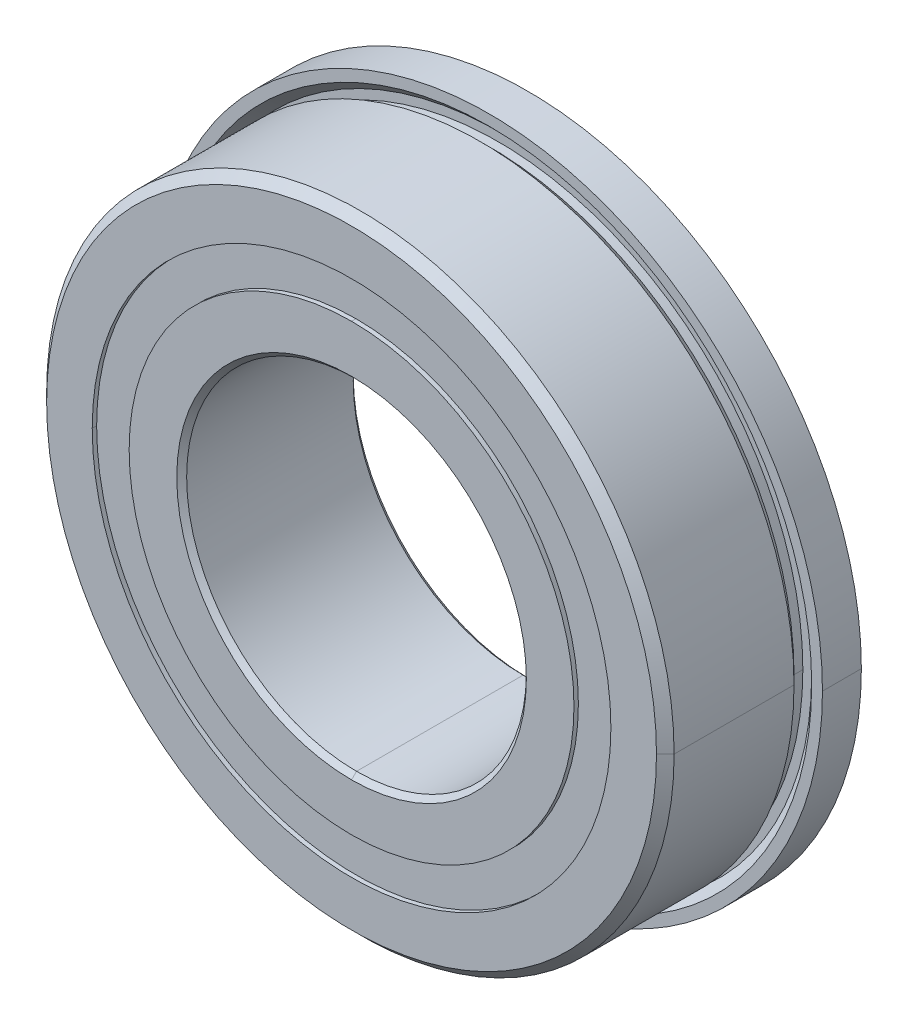
ISO-10303-21;
HEADER;
FILE_DESCRIPTION(('STEP AP214'),'2;1');
FILE_NAME('part.step','',(''),(''),'','','');
FILE_SCHEMA(('AUTOMOTIVE_DESIGN { 1 0 10303 214 1 1 1 1 }'));
ENDSEC;
DATA;
#1=APPLICATION_CONTEXT('core data for automotive mechanical design processes');
#2=APPLICATION_PROTOCOL_DEFINITION('international standard','automotive_design',2000,#1);
#3=PRODUCT_CONTEXT('',#1,'mechanical');
#4=PRODUCT('Part','Part','',(#3));
#5=PRODUCT_RELATED_PRODUCT_CATEGORY('part','',(#4));
#6=PRODUCT_DEFINITION_FORMATION('','',#4);
#7=PRODUCT_DEFINITION_CONTEXT('part definition',#1,'design');
#8=PRODUCT_DEFINITION('design','',#6,#7);
#9=PRODUCT_DEFINITION_SHAPE('','',#8);
#10=(LENGTH_UNIT() NAMED_UNIT(*) SI_UNIT(.MILLI.,.METRE.));
#11=(NAMED_UNIT(*) PLANE_ANGLE_UNIT() SI_UNIT($,.RADIAN.));
#12=(NAMED_UNIT(*) SI_UNIT($,.STERADIAN.) SOLID_ANGLE_UNIT());
#13=UNCERTAINTY_MEASURE_WITH_UNIT(LENGTH_MEASURE(1.E-05),#10,'distance_accuracy_value','');
#14=(GEOMETRIC_REPRESENTATION_CONTEXT(3) GLOBAL_UNCERTAINTY_ASSIGNED_CONTEXT((#13)) GLOBAL_UNIT_ASSIGNED_CONTEXT((#10,
#11,#12)) REPRESENTATION_CONTEXT('',''));
#15=CARTESIAN_POINT('',(0.,0.,0.));
#16=DIRECTION('',(0.,0.,1.));
#17=DIRECTION('',(1.,0.,0.));
#18=AXIS2_PLACEMENT_3D('',#15,#16,#17);
#19=CARTESIAN_POINT('',(0.,0.,3.392678));
#20=DIRECTION('',(0.,0.,-1.));
#21=DIRECTION('',(0.,-1.,0.));
#22=AXIS2_PLACEMENT_3D('',#19,#20,#21);
#23=PLANE('',#22);
#24=CARTESIAN_POINT('',(0.,0.,3.392678));
#25=DIRECTION('',(0.,0.,-1.));
#26=DIRECTION('',(-1.,0.,0.));
#27=AXIS2_PLACEMENT_3D('',#24,#25,#26);
#28=CIRCLE('',#27,9.00274725274725);
#29=CARTESIAN_POINT('',(0.,-9.00274725274725,3.392678));
#30=VERTEX_POINT('',#29);
#31=CARTESIAN_POINT('',(0.,9.00274725274725,3.392678));
#32=VERTEX_POINT('',#31);
#33=EDGE_CURVE('E171',#30,#32,#28,.T.);
#34=ORIENTED_EDGE('',*,*,#33,.T.);
#35=CARTESIAN_POINT('',(0.,0.,3.392678));
#36=DIRECTION('',(0.,0.,-1.));
#37=DIRECTION('',(-1.,0.,0.));
#38=AXIS2_PLACEMENT_3D('',#35,#36,#37);
#39=CIRCLE('',#38,9.00274725274725);
#40=EDGE_CURVE('E185',#32,#30,#39,.T.);
#41=ORIENTED_EDGE('',*,*,#40,.T.);
#42=EDGE_LOOP('',(#34,#41));
#43=FACE_BOUND('',#42,.T.);
#44=CARTESIAN_POINT('',(0.,0.,3.392678));
#45=DIRECTION('',(0.,0.,-1.));
#46=DIRECTION('',(-1.,0.,0.));
#47=AXIS2_PLACEMENT_3D('',#44,#45,#46);
#48=CIRCLE('',#47,10.4972527472527);
#49=CARTESIAN_POINT('',(-10.4972527472527,0.,3.392678));
#50=VERTEX_POINT('',#49);
#51=CARTESIAN_POINT('',(10.4972527472527,0.,3.392678));
#52=VERTEX_POINT('',#51);
#53=EDGE_CURVE('E10',#50,#52,#48,.T.);
#54=ORIENTED_EDGE('',*,*,#53,.F.);
#55=CARTESIAN_POINT('',(0.,0.,3.392678));
#56=DIRECTION('',(0.,0.,-1.));
#57=DIRECTION('',(-1.,0.,0.));
#58=AXIS2_PLACEMENT_3D('',#55,#56,#57);
#59=CIRCLE('',#58,10.4972527472527);
#60=EDGE_CURVE('E319',#52,#50,#59,.T.);
#61=ORIENTED_EDGE('',*,*,#60,.F.);
#62=EDGE_LOOP('',(#54,#61));
#63=FACE_BOUND('',#62,.T.);
#64=ADVANCED_FACE('F15',(#43,#63),#23,.F.);
#65=CARTESIAN_POINT('',(0.,0.,0.));
#66=DIRECTION('',(0.,0.,-1.));
#67=DIRECTION('',(-1.,0.,0.));
#68=AXIS2_PLACEMENT_3D('',#65,#66,#67);
#69=CYLINDRICAL_SURFACE('',#68,10.4972527472527);
#70=DIRECTION('',(0.,0.,-1.));
#71=VECTOR('',#70,1.);
#72=CARTESIAN_POINT('',(10.4972527472527,0.,0.));
#73=LINE('',#72,#71);
#74=CARTESIAN_POINT('',(10.4972527472527,0.,3.57124));
#75=VERTEX_POINT('',#74);
#76=EDGE_CURVE('E257',#75,#52,#73,.T.);
#77=ORIENTED_EDGE('',*,*,#76,.F.);
#78=CARTESIAN_POINT('',(0.,0.,3.57124));
#79=DIRECTION('',(0.,0.,-1.));
#80=DIRECTION('',(-1.,0.,0.));
#81=AXIS2_PLACEMENT_3D('',#78,#79,#80);
#82=CIRCLE('',#81,10.4972527472527);
#83=CARTESIAN_POINT('',(-10.4972527472527,0.,3.57124));
#84=VERTEX_POINT('',#83);
#85=EDGE_CURVE('E26',#84,#75,#82,.T.);
#86=ORIENTED_EDGE('',*,*,#85,.F.);
#87=DIRECTION('',(0.,0.,-1.));
#88=VECTOR('',#87,1.);
#89=CARTESIAN_POINT('',(-10.4972527472527,0.,0.));
#90=LINE('',#89,#88);
#91=EDGE_CURVE('E356',#84,#50,#90,.T.);
#92=ORIENTED_EDGE('',*,*,#91,.T.);
#93=ORIENTED_EDGE('',*,*,#53,.T.);
#94=EDGE_LOOP('',(#77,#86,#92,#93));
#95=FACE_BOUND('',#94,.T.);
#96=ADVANCED_FACE('F472',(#95),#69,.F.);
#97=CARTESIAN_POINT('',(0.,0.,3.57124));
#98=DIRECTION('',(0.,0.,-1.));
#99=DIRECTION('',(0.,-1.,0.));
#100=AXIS2_PLACEMENT_3D('',#97,#98,#99);
#101=PLANE('',#100);
#102=ORIENTED_EDGE('',*,*,#85,.T.);
#103=CARTESIAN_POINT('',(0.,0.,3.57124));
#104=DIRECTION('',(0.,0.,-1.));
#105=DIRECTION('',(-1.,0.,0.));
#106=AXIS2_PLACEMENT_3D('',#103,#104,#105);
#107=CIRCLE('',#106,10.4972527472527);
#108=EDGE_CURVE('E253',#75,#84,#107,.T.);
#109=ORIENTED_EDGE('',*,*,#108,.T.);
#110=EDGE_LOOP('',(#102,#109));
#111=FACE_BOUND('',#110,.T.);
#112=CARTESIAN_POINT('',(0.,0.,3.57124));
#113=DIRECTION('',(0.,0.,-1.));
#114=DIRECTION('',(-1.,0.,0.));
#115=AXIS2_PLACEMENT_3D('',#112,#113,#114);
#116=CIRCLE('',#115,12.3428760000003);
#117=CARTESIAN_POINT('',(-12.3428760000003,0.,3.57124));
#118=VERTEX_POINT('',#117);
#119=CARTESIAN_POINT('',(12.3428760000003,0.,3.57124));
#120=VERTEX_POINT('',#119);
#121=EDGE_CURVE('E360',#118,#120,#116,.T.);
#122=ORIENTED_EDGE('',*,*,#121,.F.);
#123=CARTESIAN_POINT('',(0.,0.,3.57124));
#124=DIRECTION('',(0.,0.,-1.));
#125=DIRECTION('',(-1.,0.,0.));
#126=AXIS2_PLACEMENT_3D('',#123,#124,#125);
#127=CIRCLE('',#126,12.3428760000003);
#128=EDGE_CURVE('E303',#120,#118,#127,.T.);
#129=ORIENTED_EDGE('',*,*,#128,.F.);
#130=EDGE_LOOP('',(#122,#129));
#131=FACE_BOUND('',#130,.T.);
#132=ADVANCED_FACE('F477',(#111,#131),#101,.F.);
#133=CARTESIAN_POINT('',(0.,0.,3.57124));
#134=DIRECTION('',(0.,0.,-1.));
#135=DIRECTION('',(-1.,0.,0.));
#136=AXIS2_PLACEMENT_3D('',#133,#134,#135);
#137=CONICAL_SURFACE('',#136,12.3428760000003,0.785398163397077);
#138=DIRECTION('',(0.707106781186285,0.,-0.70710678118681));
#139=VECTOR('',#138,1.);
#140=CARTESIAN_POINT('',(12.3428760000003,0.,3.57124));
#141=LINE('',#140,#139);
#142=CARTESIAN_POINT('',(12.7,0.,3.214116));
#143=VERTEX_POINT('',#142);
#144=EDGE_CURVE('E355',#120,#143,#141,.T.);
#145=ORIENTED_EDGE('',*,*,#144,.F.);
#146=ORIENTED_EDGE('',*,*,#128,.T.);
#147=DIRECTION('',(-0.707106781186285,0.,-0.70710678118681));
#148=VECTOR('',#147,1.);
#149=CARTESIAN_POINT('',(-12.3428760000003,0.,3.57124));
#150=LINE('',#149,#148);
#151=CARTESIAN_POINT('',(-12.7,0.,3.214116));
#152=VERTEX_POINT('',#151);
#153=EDGE_CURVE('E228',#118,#152,#150,.T.);
#154=ORIENTED_EDGE('',*,*,#153,.T.);
#155=CARTESIAN_POINT('',(0.,0.,3.214116));
#156=DIRECTION('',(0.,0.,-1.));
#157=DIRECTION('',(-1.,0.,0.));
#158=AXIS2_PLACEMENT_3D('',#155,#156,#157);
#159=CIRCLE('',#158,12.7);
#160=EDGE_CURVE('E291',#143,#152,#159,.T.);
#161=ORIENTED_EDGE('',*,*,#160,.F.);
#162=EDGE_LOOP('',(#145,#146,#154,#161));
#163=FACE_BOUND('',#162,.T.);
#164=ADVANCED_FACE('F511',(#163),#137,.T.);
#165=CARTESIAN_POINT('',(0.,0.,0.));
#166=DIRECTION('',(0.,0.,-1.));
#167=DIRECTION('',(-1.,0.,0.));
#168=AXIS2_PLACEMENT_3D('',#165,#166,#167);
#169=CYLINDRICAL_SURFACE('',#168,12.7);
#170=DIRECTION('',(0.,0.,-1.));
#171=VECTOR('',#170,1.);
#172=CARTESIAN_POINT('',(12.7,0.,0.));
#173=LINE('',#172,#171);
#174=CARTESIAN_POINT('',(12.7,0.,-1.63931600000027));
#175=VERTEX_POINT('',#174);
#176=EDGE_CURVE('E223',#143,#175,#173,.T.);
#177=ORIENTED_EDGE('',*,*,#176,.F.);
#178=ORIENTED_EDGE('',*,*,#160,.T.);
#179=DIRECTION('',(0.,0.,-1.));
#180=VECTOR('',#179,1.);
#181=CARTESIAN_POINT('',(-12.7,0.,0.));
#182=LINE('',#181,#180);
#183=CARTESIAN_POINT('',(-12.7,0.,-1.63931600000027));
#184=VERTEX_POINT('',#183);
#185=EDGE_CURVE('E240',#152,#184,#182,.T.);
#186=ORIENTED_EDGE('',*,*,#185,.T.);
#187=CARTESIAN_POINT('',(0.,0.,-1.63931600000027));
#188=DIRECTION('',(0.,0.,-1.));
#189=DIRECTION('',(-1.,0.,0.));
#190=AXIS2_PLACEMENT_3D('',#187,#188,#189);
#191=CIRCLE('',#190,12.7);
#192=EDGE_CURVE('E287',#175,#184,#191,.T.);
#193=ORIENTED_EDGE('',*,*,#192,.F.);
#194=EDGE_LOOP('',(#177,#178,#186,#193));
#195=FACE_BOUND('',#194,.T.);
#196=ADVANCED_FACE('F513',(#195),#169,.T.);
#197=CARTESIAN_POINT('',(0.,0.,-1.63931600000027));
#198=DIRECTION('',(0.,0.,1.));
#199=DIRECTION('',(1.,0.,0.));
#200=AXIS2_PLACEMENT_3D('',#197,#198,#199);
#201=CONICAL_SURFACE('',#200,12.7,0.785398163397787);
#202=DIRECTION('',(-0.707106781186788,0.,0.707106781186307));
#203=VECTOR('',#202,1.);
#204=CARTESIAN_POINT('',(-12.7,0.,-1.63931600000027));
#205=LINE('',#204,#203);
#206=CARTESIAN_POINT('',(-12.342876,0.,-1.99644));
#207=VERTEX_POINT('',#206);
#208=EDGE_CURVE('E207',#207,#184,#205,.T.);
#209=ORIENTED_EDGE('',*,*,#208,.F.);
#210=CARTESIAN_POINT('',(0.,0.,-1.99644));
#211=DIRECTION('',(0.,0.,-1.));
#212=DIRECTION('',(-1.,0.,0.));
#213=AXIS2_PLACEMENT_3D('',#210,#211,#212);
#214=CIRCLE('',#213,12.342876);
#215=CARTESIAN_POINT('',(12.342876,0.,-1.99644));
#216=VERTEX_POINT('',#215);
#217=EDGE_CURVE('E286',#216,#207,#214,.T.);
#218=ORIENTED_EDGE('',*,*,#217,.F.);
#219=DIRECTION('',(0.707106781186788,0.,0.707106781186307));
#220=VECTOR('',#219,1.);
#221=CARTESIAN_POINT('',(12.7,0.,-1.63931600000027));
#222=LINE('',#221,#220);
#223=EDGE_CURVE('E204',#216,#175,#222,.T.);
#224=ORIENTED_EDGE('',*,*,#223,.T.);
#225=ORIENTED_EDGE('',*,*,#192,.T.);
#226=EDGE_LOOP('',(#209,#218,#224,#225));
#227=FACE_BOUND('',#226,.T.);
#228=ADVANCED_FACE('F536',(#227),#201,.T.);
#229=CARTESIAN_POINT('',(0.,0.,0.));
#230=DIRECTION('',(0.,0.,-1.));
#231=DIRECTION('',(-1.,0.,0.));
#232=AXIS2_PLACEMENT_3D('',#229,#230,#231);
#233=CYLINDRICAL_SURFACE('',#232,12.342876);
#234=DIRECTION('',(0.,0.,-1.));
#235=VECTOR('',#234,1.);
#236=CARTESIAN_POINT('',(12.342876,0.,0.));
#237=LINE('',#236,#235);
#238=CARTESIAN_POINT('',(12.342876,0.,-2.35356399999971));
#239=VERTEX_POINT('',#238);
#240=EDGE_CURVE('E19',#216,#239,#237,.T.);
#241=ORIENTED_EDGE('',*,*,#240,.F.);
#242=ORIENTED_EDGE('',*,*,#217,.T.);
#243=DIRECTION('',(0.,0.,-1.));
#244=VECTOR('',#243,1.);
#245=CARTESIAN_POINT('',(-12.342876,0.,0.));
#246=LINE('',#245,#244);
#247=CARTESIAN_POINT('',(-12.342876,0.,-2.35356399999971));
#248=VERTEX_POINT('',#247);
#249=EDGE_CURVE('E233',#207,#248,#246,.T.);
#250=ORIENTED_EDGE('',*,*,#249,.T.);
#251=CARTESIAN_POINT('',(0.,0.,-2.35356399999971));
#252=DIRECTION('',(0.,0.,-1.));
#253=DIRECTION('',(-1.,0.,0.));
#254=AXIS2_PLACEMENT_3D('',#251,#252,#253);
#255=CIRCLE('',#254,12.342876);
#256=EDGE_CURVE('E283',#239,#248,#255,.T.);
#257=ORIENTED_EDGE('',*,*,#256,.F.);
#258=EDGE_LOOP('',(#241,#242,#250,#257));
#259=FACE_BOUND('',#258,.T.);
#260=ADVANCED_FACE('F539',(#259),#233,.T.);
#261=CARTESIAN_POINT('',(0.,0.,-2.35356399999971));
#262=DIRECTION('',(0.,0.,-1.));
#263=DIRECTION('',(0.,-1.,0.));
#264=AXIS2_PLACEMENT_3D('',#261,#262,#263);
#265=PLANE('',#264);
#266=CARTESIAN_POINT('',(0.,0.,-2.35356399999971));
#267=DIRECTION('',(0.,0.,-1.));
#268=DIRECTION('',(-1.,0.,0.));
#269=AXIS2_PLACEMENT_3D('',#266,#267,#268);
#270=CIRCLE('',#269,12.342876);
#271=EDGE_CURVE('E229',#248,#239,#270,.T.);
#272=ORIENTED_EDGE('',*,*,#271,.T.);
#273=ORIENTED_EDGE('',*,*,#256,.T.);
#274=EDGE_LOOP('',(#272,#273));
#275=FACE_BOUND('',#274,.T.);
#276=CARTESIAN_POINT('',(0.,0.,-2.35356399999971));
#277=DIRECTION('',(0.,0.,-1.));
#278=DIRECTION('',(-1.,0.,0.));
#279=AXIS2_PLACEMENT_3D('',#276,#277,#278);
#280=CIRCLE('',#279,12.6999999999998);
#281=CARTESIAN_POINT('',(12.6999999999998,0.,-2.35356399999971));
#282=VERTEX_POINT('',#281);
#283=CARTESIAN_POINT('',(-12.6999999999998,0.,-2.35356399999971));
#284=VERTEX_POINT('',#283);
#285=EDGE_CURVE('E249',#282,#284,#280,.T.);
#286=ORIENTED_EDGE('',*,*,#285,.F.);
#287=CARTESIAN_POINT('',(0.,0.,-2.35356399999971));
#288=DIRECTION('',(0.,0.,-1.));
#289=DIRECTION('',(-1.,0.,0.));
#290=AXIS2_PLACEMENT_3D('',#287,#288,#289);
#291=CIRCLE('',#290,12.6999999999998);
#292=EDGE_CURVE('E268',#284,#282,#291,.T.);
#293=ORIENTED_EDGE('',*,*,#292,.F.);
#294=EDGE_LOOP('',(#286,#293));
#295=FACE_BOUND('',#294,.T.);
#296=ADVANCED_FACE('F494',(#275,#295),#265,.F.);
#297=CARTESIAN_POINT('',(0.,0.,-2.35356399999971));
#298=DIRECTION('',(0.,0.,1.));
#299=DIRECTION('',(1.,0.,0.));
#300=AXIS2_PLACEMENT_3D('',#297,#298,#299);
#301=CONICAL_SURFACE('',#300,12.6999999999998,0.785398163397835);
#302=DIRECTION('',(-0.707106781186821,0.,0.707106781186274));
#303=VECTOR('',#302,1.);
#304=CARTESIAN_POINT('',(-12.6999999999998,0.,-2.35356399999971));
#305=LINE('',#304,#303);
#306=CARTESIAN_POINT('',(-13.0571239999997,0.,-1.99644));
#307=VERTEX_POINT('',#306);
#308=EDGE_CURVE('E244',#284,#307,#305,.T.);
#309=ORIENTED_EDGE('',*,*,#308,.F.);
#310=ORIENTED_EDGE('',*,*,#292,.T.);
#311=DIRECTION('',(0.707106781186821,0.,0.707106781186274));
#312=VECTOR('',#311,1.);
#313=CARTESIAN_POINT('',(12.6999999999998,0.,-2.35356399999971));
#314=LINE('',#313,#312);
#315=CARTESIAN_POINT('',(13.0571239999997,0.,-1.99644));
#316=VERTEX_POINT('',#315);
#317=EDGE_CURVE('E327',#282,#316,#314,.T.);
#318=ORIENTED_EDGE('',*,*,#317,.T.);
#319=CARTESIAN_POINT('',(0.,0.,-1.99644));
#320=DIRECTION('',(0.,0.,-1.));
#321=DIRECTION('',(-1.,0.,0.));
#322=AXIS2_PLACEMENT_3D('',#319,#320,#321);
#323=CIRCLE('',#322,13.0571239999997);
#324=EDGE_CURVE('E264',#307,#316,#323,.T.);
#325=ORIENTED_EDGE('',*,*,#324,.F.);
#326=EDGE_LOOP('',(#309,#310,#318,#325));
#327=FACE_BOUND('',#326,.T.);
#328=ADVANCED_FACE('F492',(#327),#301,.F.);
#329=CARTESIAN_POINT('',(0.,0.,-1.99644));
#330=DIRECTION('',(0.,0.,-1.));
#331=DIRECTION('',(0.,-1.,0.));
#332=AXIS2_PLACEMENT_3D('',#329,#330,#331);
#333=PLANE('',#332);
#334=CARTESIAN_POINT('',(0.,0.,-1.99644));
#335=DIRECTION('',(0.,0.,-1.));
#336=DIRECTION('',(-1.,0.,0.));
#337=AXIS2_PLACEMENT_3D('',#334,#335,#336);
#338=CIRCLE('',#337,13.0571239999997);
#339=EDGE_CURVE('E248',#316,#307,#338,.T.);
#340=ORIENTED_EDGE('',*,*,#339,.T.);
#341=ORIENTED_EDGE('',*,*,#324,.T.);
#342=EDGE_LOOP('',(#340,#341));
#343=FACE_BOUND('',#342,.T.);
#344=CARTESIAN_POINT('',(0.,0.,-1.99644));
#345=DIRECTION('',(0.,0.,-1.));
#346=DIRECTION('',(-1.,0.,0.));
#347=AXIS2_PLACEMENT_3D('',#344,#345,#346);
#348=CIRCLE('',#347,13.49375);
#349=CARTESIAN_POINT('',(-13.49375,0.,-1.99644));
#350=VERTEX_POINT('',#349);
#351=CARTESIAN_POINT('',(13.49375,0.,-1.99644));
#352=VERTEX_POINT('',#351);
#353=EDGE_CURVE('E277',#350,#352,#348,.T.);
#354=ORIENTED_EDGE('',*,*,#353,.F.);
#355=CARTESIAN_POINT('',(0.,0.,-1.99644));
#356=DIRECTION('',(0.,0.,-1.));
#357=DIRECTION('',(-1.,0.,0.));
#358=AXIS2_PLACEMENT_3D('',#355,#356,#357);
#359=CIRCLE('',#358,13.49375);
#360=EDGE_CURVE('E217',#352,#350,#359,.T.);
#361=ORIENTED_EDGE('',*,*,#360,.F.);
#362=EDGE_LOOP('',(#354,#361));
#363=FACE_BOUND('',#362,.T.);
#364=ADVANCED_FACE('F487',(#343,#363),#333,.F.);
#365=CARTESIAN_POINT('',(0.,0.,0.));
#366=DIRECTION('',(0.,0.,-1.));
#367=DIRECTION('',(-1.,0.,0.));
#368=AXIS2_PLACEMENT_3D('',#365,#366,#367);
#369=CYLINDRICAL_SURFACE('',#368,13.49375);
#370=DIRECTION('',(0.,0.,-1.));
#371=VECTOR('',#370,1.);
#372=CARTESIAN_POINT('',(13.49375,0.,0.));
#373=LINE('',#372,#371);
#374=CARTESIAN_POINT('',(13.49375,0.,-3.57124));
#375=VERTEX_POINT('',#374);
#376=EDGE_CURVE('E272',#352,#375,#373,.T.);
#377=ORIENTED_EDGE('',*,*,#376,.F.);
#378=ORIENTED_EDGE('',*,*,#360,.T.);
#379=DIRECTION('',(0.,0.,-1.));
#380=VECTOR('',#379,1.);
#381=CARTESIAN_POINT('',(-13.49375,0.,0.));
#382=LINE('',#381,#380);
#383=CARTESIAN_POINT('',(-13.49375,0.,-3.57124));
#384=VERTEX_POINT('',#383);
#385=EDGE_CURVE('E323',#350,#384,#382,.T.);
#386=ORIENTED_EDGE('',*,*,#385,.T.);
#387=CARTESIAN_POINT('',(0.,0.,-3.57124));
#388=DIRECTION('',(0.,0.,-1.));
#389=DIRECTION('',(-1.,0.,0.));
#390=AXIS2_PLACEMENT_3D('',#387,#388,#389);
#391=CIRCLE('',#390,13.49375);
#392=EDGE_CURVE('E213',#375,#384,#391,.T.);
#393=ORIENTED_EDGE('',*,*,#392,.F.);
#394=EDGE_LOOP('',(#377,#378,#386,#393));
#395=FACE_BOUND('',#394,.T.);
#396=ADVANCED_FACE('F483',(#395),#369,.T.);
#397=CARTESIAN_POINT('',(0.,0.,-3.57124));
#398=DIRECTION('',(0.,0.,1.));
#399=DIRECTION('',(1.,0.,0.));
#400=AXIS2_PLACEMENT_3D('',#397,#398,#399);
#401=PLANE('',#400);
#402=CARTESIAN_POINT('',(0.,0.,-3.57124));
#403=DIRECTION('',(0.,0.,-1.));
#404=DIRECTION('',(-1.,0.,0.));
#405=AXIS2_PLACEMENT_3D('',#402,#403,#404);
#406=CIRCLE('',#405,10.4972527472527);
#407=CARTESIAN_POINT('',(-10.4972527472527,0.,-3.57124));
#408=VERTEX_POINT('',#407);
#409=CARTESIAN_POINT('',(10.4972527472527,0.,-3.57124));
#410=VERTEX_POINT('',#409);
#411=EDGE_CURVE('E218',#408,#410,#406,.T.);
#412=ORIENTED_EDGE('',*,*,#411,.F.);
#413=CARTESIAN_POINT('',(0.,0.,-3.57124));
#414=DIRECTION('',(0.,0.,-1.));
#415=DIRECTION('',(-1.,0.,0.));
#416=AXIS2_PLACEMENT_3D('',#413,#414,#415);
#417=CIRCLE('',#416,10.4972527472527);
#418=EDGE_CURVE('E262',#410,#408,#417,.T.);
#419=ORIENTED_EDGE('',*,*,#418,.F.);
#420=EDGE_LOOP('',(#412,#419));
#421=FACE_BOUND('',#420,.T.);
#422=CARTESIAN_POINT('',(0.,0.,-3.57124));
#423=DIRECTION('',(0.,0.,-1.));
#424=DIRECTION('',(-1.,0.,0.));
#425=AXIS2_PLACEMENT_3D('',#422,#423,#424);
#426=CIRCLE('',#425,13.49375);
#427=EDGE_CURVE('E276',#384,#375,#426,.T.);
#428=ORIENTED_EDGE('',*,*,#427,.T.);
#429=ORIENTED_EDGE('',*,*,#392,.T.);
#430=EDGE_LOOP('',(#428,#429));
#431=FACE_BOUND('',#430,.T.);
#432=ADVANCED_FACE('F486',(#421,#431),#401,.F.);
#433=CARTESIAN_POINT('',(0.,0.,0.));
#434=DIRECTION('',(0.,0.,-1.));
#435=DIRECTION('',(-1.,0.,0.));
#436=AXIS2_PLACEMENT_3D('',#433,#434,#435);
#437=CYLINDRICAL_SURFACE('',#436,10.4972527472527);
#438=DIRECTION('',(0.,0.,-1.));
#439=VECTOR('',#438,1.);
#440=CARTESIAN_POINT('',(10.4972527472527,0.,0.));
#441=LINE('',#440,#439);
#442=CARTESIAN_POINT('',(10.4972527472527,0.,-3.392678));
#443=VERTEX_POINT('',#442);
#444=EDGE_CURVE('E258',#443,#410,#441,.T.);
#445=ORIENTED_EDGE('',*,*,#444,.F.);
#446=CARTESIAN_POINT('',(0.,0.,-3.392678));
#447=DIRECTION('',(0.,0.,-1.));
#448=DIRECTION('',(-1.,0.,0.));
#449=AXIS2_PLACEMENT_3D('',#446,#447,#448);
#450=CIRCLE('',#449,10.4972527472527);
#451=CARTESIAN_POINT('',(-10.4972527472527,0.,-3.392678));
#452=VERTEX_POINT('',#451);
#453=EDGE_CURVE('E211',#452,#443,#450,.T.);
#454=ORIENTED_EDGE('',*,*,#453,.F.);
#455=DIRECTION('',(0.,0.,-1.));
#456=VECTOR('',#455,1.);
#457=CARTESIAN_POINT('',(-10.4972527472527,0.,0.));
#458=LINE('',#457,#456);
#459=EDGE_CURVE('E278',#452,#408,#458,.T.);
#460=ORIENTED_EDGE('',*,*,#459,.T.);
#461=ORIENTED_EDGE('',*,*,#411,.T.);
#462=EDGE_LOOP('',(#445,#454,#460,#461));
#463=FACE_BOUND('',#462,.T.);
#464=ADVANCED_FACE('F500',(#463),#437,.F.);
#465=CARTESIAN_POINT('',(0.,0.,-3.392678));
#466=DIRECTION('',(0.,0.,1.));
#467=DIRECTION('',(1.,0.,0.));
#468=AXIS2_PLACEMENT_3D('',#465,#466,#467);
#469=PLANE('',#468);
#470=CARTESIAN_POINT('',(0.,0.,-3.392678));
#471=DIRECTION('',(0.,0.,1.));
#472=DIRECTION('',(1.,0.,0.));
#473=AXIS2_PLACEMENT_3D('',#470,#471,#472);
#474=CIRCLE('',#473,9.00274725274725);
#475=CARTESIAN_POINT('',(0.,-9.00274725274726,-3.392678));
#476=VERTEX_POINT('',#475);
#477=CARTESIAN_POINT('',(0.,9.00274725274725,-3.392678));
#478=VERTEX_POINT('',#477);
#479=EDGE_CURVE('E200',#476,#478,#474,.T.);
#480=ORIENTED_EDGE('',*,*,#479,.T.);
#481=CARTESIAN_POINT('',(0.,0.,-3.392678));
#482=DIRECTION('',(0.,0.,1.));
#483=DIRECTION('',(1.,0.,0.));
#484=AXIS2_PLACEMENT_3D('',#481,#482,#483);
#485=CIRCLE('',#484,9.00274725274725);
#486=EDGE_CURVE('E315',#478,#476,#485,.T.);
#487=ORIENTED_EDGE('',*,*,#486,.T.);
#488=EDGE_LOOP('',(#480,#487));
#489=FACE_BOUND('',#488,.T.);
#490=ORIENTED_EDGE('',*,*,#453,.T.);
#491=CARTESIAN_POINT('',(0.,0.,-3.392678));
#492=DIRECTION('',(0.,0.,-1.));
#493=DIRECTION('',(-1.,0.,0.));
#494=AXIS2_PLACEMENT_3D('',#491,#492,#493);
#495=CIRCLE('',#494,10.4972527472527);
#496=EDGE_CURVE('E263',#443,#452,#495,.T.);
#497=ORIENTED_EDGE('',*,*,#496,.T.);
#498=EDGE_LOOP('',(#490,#497));
#499=FACE_BOUND('',#498,.T.);
#500=ADVANCED_FACE('F503',(#489,#499),#469,.F.);
#501=CARTESIAN_POINT('',(0.,0.,-3.57124));
#502=DIRECTION('',(0.,0.,-1.));
#503=DIRECTION('',(0.,1.,0.));
#504=AXIS2_PLACEMENT_3D('',#501,#502,#503);
#505=CONICAL_SURFACE('',#504,7.075,0.785398163397446);
#506=DIRECTION('',(0.,-0.707106781186546,-0.707106781186549));
#507=VECTOR('',#506,1.);
#508=CARTESIAN_POINT('',(0.,-7.075,-3.57124));
#509=LINE('',#508,#507);
#510=CARTESIAN_POINT('',(0.,-6.875,-3.37124));
#511=VERTEX_POINT('',#510);
#512=CARTESIAN_POINT('',(0.,-7.075,-3.57124));
#513=VERTEX_POINT('',#512);
#514=EDGE_CURVE('E367',#511,#513,#509,.T.);
#515=ORIENTED_EDGE('',*,*,#514,.F.);
#516=CARTESIAN_POINT('',(0.,0.,-3.37124));
#517=DIRECTION('',(0.,0.,-1.));
#518=DIRECTION('',(0.,-1.,0.));
#519=AXIS2_PLACEMENT_3D('',#516,#517,#518);
#520=CIRCLE('',#519,6.875);
#521=CARTESIAN_POINT('',(0.,6.875,-3.37124));
#522=VERTEX_POINT('',#521);
#523=EDGE_CURVE('E296',#522,#511,#520,.T.);
#524=ORIENTED_EDGE('',*,*,#523,.F.);
#525=DIRECTION('',(0.,0.707106781186546,-0.707106781186549));
#526=VECTOR('',#525,1.);
#527=CARTESIAN_POINT('',(0.,7.075,-3.57124));
#528=LINE('',#527,#526);
#529=CARTESIAN_POINT('',(0.,7.075,-3.57124));
#530=VERTEX_POINT('',#529);
#531=EDGE_CURVE('E340',#522,#530,#528,.T.);
#532=ORIENTED_EDGE('',*,*,#531,.T.);
#533=CARTESIAN_POINT('',(0.,0.,-3.57124));
#534=DIRECTION('',(0.,0.,1.));
#535=DIRECTION('',(0.,-1.,0.));
#536=AXIS2_PLACEMENT_3D('',#533,#534,#535);
#537=CIRCLE('',#536,7.075);
#538=EDGE_CURVE('E299',#513,#530,#537,.T.);
#539=ORIENTED_EDGE('',*,*,#538,.F.);
#540=EDGE_LOOP('',(#515,#524,#532,#539));
#541=FACE_BOUND('',#540,.T.);
#542=ADVANCED_FACE('F450',(#541),#505,.F.);
#543=CARTESIAN_POINT('',(0.,0.,3.37124));
#544=DIRECTION('',(0.,0.,1.));
#545=DIRECTION('',(0.,-1.,0.));
#546=AXIS2_PLACEMENT_3D('',#543,#544,#545);
#547=CONICAL_SURFACE('',#546,6.875,0.785398163397443);
#548=DIRECTION('',(0.,0.707106781186545,0.707106781186551));
#549=VECTOR('',#548,1.);
#550=CARTESIAN_POINT('',(0.,6.875,3.37124));
#551=LINE('',#550,#549);
#552=CARTESIAN_POINT('',(0.,6.875,3.37124));
#553=VERTEX_POINT('',#552);
#554=CARTESIAN_POINT('',(0.,7.075,3.57124));
#555=VERTEX_POINT('',#554);
#556=EDGE_CURVE('E371',#553,#555,#551,.T.);
#557=ORIENTED_EDGE('',*,*,#556,.F.);
#558=CARTESIAN_POINT('',(0.,0.,3.37124));
#559=DIRECTION('',(0.,0.,1.));
#560=DIRECTION('',(0.,1.,0.));
#561=AXIS2_PLACEMENT_3D('',#558,#559,#560);
#562=CIRCLE('',#561,6.875);
#563=CARTESIAN_POINT('',(0.,-6.875,3.37124));
#564=VERTEX_POINT('',#563);
#565=EDGE_CURVE('E212',#564,#553,#562,.T.);
#566=ORIENTED_EDGE('',*,*,#565,.F.);
#567=DIRECTION('',(0.,-0.707106781186544,0.707106781186551));
#568=VECTOR('',#567,1.);
#569=CARTESIAN_POINT('',(0.,-6.875,3.37124));
#570=LINE('',#569,#568);
#571=CARTESIAN_POINT('',(0.,-7.075,3.57124));
#572=VERTEX_POINT('',#571);
#573=EDGE_CURVE('E328',#564,#572,#570,.T.);
#574=ORIENTED_EDGE('',*,*,#573,.T.);
#575=CARTESIAN_POINT('',(0.,0.,3.57124));
#576=DIRECTION('',(0.,0.,-1.));
#577=DIRECTION('',(0.,1.,0.));
#578=AXIS2_PLACEMENT_3D('',#575,#576,#577);
#579=CIRCLE('',#578,7.075);
#580=EDGE_CURVE('E208',#555,#572,#579,.T.);
#581=ORIENTED_EDGE('',*,*,#580,.F.);
#582=EDGE_LOOP('',(#557,#566,#574,#581));
#583=FACE_BOUND('',#582,.T.);
#584=ADVANCED_FACE('F457',(#583),#547,.F.);
#585=CARTESIAN_POINT('',(0.,7.15712399999974,3.57124));
#586=DIRECTION('',(0.,0.,-1.));
#587=DIRECTION('',(0.,-1.,0.));
#588=AXIS2_PLACEMENT_3D('',#585,#586,#587);
#589=PLANE('',#588);
#590=CARTESIAN_POINT('',(0.,0.,3.57124));
#591=DIRECTION('',(0.,0.,-1.));
#592=DIRECTION('',(0.,1.,0.));
#593=AXIS2_PLACEMENT_3D('',#590,#591,#592);
#594=CIRCLE('',#593,7.075);
#595=EDGE_CURVE('E332',#572,#555,#594,.T.);
#596=ORIENTED_EDGE('',*,*,#595,.T.);
#597=ORIENTED_EDGE('',*,*,#580,.T.);
#598=EDGE_LOOP('',(#596,#597));
#599=FACE_BOUND('',#598,.T.);
#600=CARTESIAN_POINT('',(0.,0.,3.57124));
#601=DIRECTION('',(0.,0.,1.));
#602=DIRECTION('',(0.,-1.,0.));
#603=AXIS2_PLACEMENT_3D('',#600,#601,#602);
#604=CIRCLE('',#603,9.00274725274725);
#605=CARTESIAN_POINT('',(0.,-9.00274725274725,3.57124));
#606=VERTEX_POINT('',#605);
#607=CARTESIAN_POINT('',(0.,9.00274725274725,3.57124));
#608=VERTEX_POINT('',#607);
#609=EDGE_CURVE('E186',#606,#608,#604,.T.);
#610=ORIENTED_EDGE('',*,*,#609,.T.);
#611=CARTESIAN_POINT('',(0.,0.,3.57124));
#612=DIRECTION('',(0.,0.,1.));
#613=DIRECTION('',(0.,-1.,0.));
#614=AXIS2_PLACEMENT_3D('',#611,#612,#613);
#615=CIRCLE('',#614,9.00274725274725);
#616=EDGE_CURVE('E39',#608,#606,#615,.T.);
#617=ORIENTED_EDGE('',*,*,#616,.T.);
#618=EDGE_LOOP('',(#610,#617));
#619=FACE_BOUND('',#618,.T.);
#620=ADVANCED_FACE('F459',(#599,#619),#589,.F.);
#621=CARTESIAN_POINT('',(0.,0.,3.57124));
#622=DIRECTION('',(0.,0.,1.));
#623=DIRECTION('',(0.,-1.,0.));
#624=AXIS2_PLACEMENT_3D('',#621,#622,#623);
#625=CYLINDRICAL_SURFACE('',#624,6.875);
#626=DIRECTION('',(0.,0.,1.));
#627=VECTOR('',#626,1.);
#628=CARTESIAN_POINT('',(0.,6.875,3.57124));
#629=LINE('',#628,#627);
#630=EDGE_CURVE('E239',#522,#553,#629,.T.);
#631=ORIENTED_EDGE('',*,*,#630,.F.);
#632=ORIENTED_EDGE('',*,*,#523,.T.);
#633=DIRECTION('',(0.,0.,1.));
#634=VECTOR('',#633,1.);
#635=CARTESIAN_POINT('',(0.,-6.875,3.57124));
#636=LINE('',#635,#634);
#637=EDGE_CURVE('E234',#511,#564,#636,.T.);
#638=ORIENTED_EDGE('',*,*,#637,.T.);
#639=ORIENTED_EDGE('',*,*,#565,.T.);
#640=EDGE_LOOP('',(#631,#632,#638,#639));
#641=FACE_BOUND('',#640,.T.);
#642=ADVANCED_FACE('F455',(#641),#625,.F.);
#643=CARTESIAN_POINT('',(0.,6.875,-3.57124));
#644=DIRECTION('',(0.,0.,1.));
#645=DIRECTION('',(0.,-1.,0.));
#646=AXIS2_PLACEMENT_3D('',#643,#644,#645);
#647=PLANE('',#646);
#648=CARTESIAN_POINT('',(0.,0.,-3.57124));
#649=DIRECTION('',(0.,0.,1.));
#650=DIRECTION('',(0.,-1.,0.));
#651=AXIS2_PLACEMENT_3D('',#648,#649,#650);
#652=CIRCLE('',#651,7.075);
#653=EDGE_CURVE('E345',#530,#513,#652,.T.);
#654=ORIENTED_EDGE('',*,*,#653,.T.);
#655=ORIENTED_EDGE('',*,*,#538,.T.);
#656=EDGE_LOOP('',(#654,#655));
#657=FACE_BOUND('',#656,.T.);
#658=CARTESIAN_POINT('',(0.,0.,-3.57124));
#659=DIRECTION('',(0.,0.,1.));
#660=DIRECTION('',(0.,-1.,0.));
#661=AXIS2_PLACEMENT_3D('',#658,#659,#660);
#662=CIRCLE('',#661,9.00274725274725);
#663=CARTESIAN_POINT('',(0.,-9.00274725274726,-3.57124));
#664=VERTEX_POINT('',#663);
#665=CARTESIAN_POINT('',(0.,9.00274725274725,-3.57124));
#666=VERTEX_POINT('',#665);
#667=EDGE_CURVE('E238',#664,#666,#662,.T.);
#668=ORIENTED_EDGE('',*,*,#667,.F.);
#669=CARTESIAN_POINT('',(0.,0.,-3.57124));
#670=DIRECTION('',(0.,0.,1.));
#671=DIRECTION('',(0.,-1.,0.));
#672=AXIS2_PLACEMENT_3D('',#669,#670,#671);
#673=CIRCLE('',#672,9.00274725274725);
#674=EDGE_CURVE('E270',#666,#664,#673,.T.);
#675=ORIENTED_EDGE('',*,*,#674,.F.);
#676=EDGE_LOOP('',(#668,#675));
#677=FACE_BOUND('',#676,.T.);
#678=ADVANCED_FACE('F442',(#657,#677),#647,.F.);
#679=CARTESIAN_POINT('',(0.,0.,3.57124));
#680=DIRECTION('',(0.,0.,1.));
#681=DIRECTION('',(0.,-1.,0.));
#682=AXIS2_PLACEMENT_3D('',#679,#680,#681);
#683=CYLINDRICAL_SURFACE('',#682,9.00274725274725);
#684=DIRECTION('',(0.,0.,1.));
#685=VECTOR('',#684,1.);
#686=CARTESIAN_POINT('',(0.,9.00274725274725,3.57124));
#687=LINE('',#686,#685);
#688=EDGE_CURVE('E306',#666,#478,#687,.T.);
#689=ORIENTED_EDGE('',*,*,#688,.F.);
#690=ORIENTED_EDGE('',*,*,#674,.T.);
#691=DIRECTION('',(0.,0.,1.));
#692=VECTOR('',#691,1.);
#693=CARTESIAN_POINT('',(0.,-9.00274725274725,3.57124));
#694=LINE('',#693,#692);
#695=EDGE_CURVE('E191',#664,#476,#694,.T.);
#696=ORIENTED_EDGE('',*,*,#695,.T.);
#697=ORIENTED_EDGE('',*,*,#486,.F.);
#698=EDGE_LOOP('',(#689,#690,#696,#697));
#699=FACE_BOUND('',#698,.T.);
#700=ADVANCED_FACE('F544',(#699),#683,.T.);
#701=CARTESIAN_POINT('',(0.,0.,3.57124));
#702=DIRECTION('',(0.,0.,1.));
#703=DIRECTION('',(0.,-1.,0.));
#704=AXIS2_PLACEMENT_3D('',#701,#702,#703);
#705=CYLINDRICAL_SURFACE('',#704,9.00274725274725);
#706=DIRECTION('',(0.,0.,1.));
#707=VECTOR('',#706,1.);
#708=CARTESIAN_POINT('',(0.,9.00274725274725,3.57124));
#709=LINE('',#708,#707);
#710=EDGE_CURVE('E177',#32,#608,#709,.T.);
#711=ORIENTED_EDGE('',*,*,#710,.F.);
#712=ORIENTED_EDGE('',*,*,#33,.F.);
#713=DIRECTION('',(0.,0.,1.));
#714=VECTOR('',#713,1.);
#715=CARTESIAN_POINT('',(0.,-9.00274725274725,3.57124));
#716=LINE('',#715,#714);
#717=EDGE_CURVE('E174',#30,#606,#716,.T.);
#718=ORIENTED_EDGE('',*,*,#717,.T.);
#719=ORIENTED_EDGE('',*,*,#616,.F.);
#720=EDGE_LOOP('',(#711,#712,#718,#719));
#721=FACE_BOUND('',#720,.T.);
#722=ADVANCED_FACE('F173',(#721),#705,.T.);
#723=CARTESIAN_POINT('',(0.,0.,3.57124));
#724=DIRECTION('',(0.,0.,1.));
#725=DIRECTION('',(0.,-1.,0.));
#726=AXIS2_PLACEMENT_3D('',#723,#724,#725);
#727=CYLINDRICAL_SURFACE('',#726,9.00274725274725);
#728=ORIENTED_EDGE('',*,*,#40,.F.);
#729=ORIENTED_EDGE('',*,*,#710,.T.);
#730=ORIENTED_EDGE('',*,*,#609,.F.);
#731=ORIENTED_EDGE('',*,*,#717,.F.);
#732=EDGE_LOOP('',(#728,#729,#730,#731));
#733=FACE_BOUND('',#732,.T.);
#734=ADVANCED_FACE('F184',(#733),#727,.T.);
#735=CARTESIAN_POINT('',(0.,0.,3.57124));
#736=DIRECTION('',(0.,0.,1.));
#737=DIRECTION('',(0.,-1.,0.));
#738=AXIS2_PLACEMENT_3D('',#735,#736,#737);
#739=CYLINDRICAL_SURFACE('',#738,9.00274725274725);
#740=ORIENTED_EDGE('',*,*,#667,.T.);
#741=ORIENTED_EDGE('',*,*,#688,.T.);
#742=ORIENTED_EDGE('',*,*,#479,.F.);
#743=ORIENTED_EDGE('',*,*,#695,.F.);
#744=EDGE_LOOP('',(#740,#741,#742,#743));
#745=FACE_BOUND('',#744,.T.);
#746=ADVANCED_FACE('F499',(#745),#739,.T.);
#747=CARTESIAN_POINT('',(0.,0.,3.57124));
#748=DIRECTION('',(0.,0.,1.));
#749=DIRECTION('',(0.,-1.,0.));
#750=AXIS2_PLACEMENT_3D('',#747,#748,#749);
#751=CYLINDRICAL_SURFACE('',#750,6.875);
#752=CARTESIAN_POINT('',(0.,0.,-3.37124));
#753=DIRECTION('',(0.,0.,-1.));
#754=DIRECTION('',(0.,-1.,0.));
#755=AXIS2_PLACEMENT_3D('',#752,#753,#754);
#756=CIRCLE('',#755,6.875);
#757=EDGE_CURVE('E282',#511,#522,#756,.T.);
#758=ORIENTED_EDGE('',*,*,#757,.T.);
#759=ORIENTED_EDGE('',*,*,#630,.T.);
#760=CARTESIAN_POINT('',(0.,0.,3.37124));
#761=DIRECTION('',(0.,0.,1.));
#762=DIRECTION('',(0.,1.,0.));
#763=AXIS2_PLACEMENT_3D('',#760,#761,#762);
#764=CIRCLE('',#763,6.875);
#765=EDGE_CURVE('E344',#553,#564,#764,.T.);
#766=ORIENTED_EDGE('',*,*,#765,.T.);
#767=ORIENTED_EDGE('',*,*,#637,.F.);
#768=EDGE_LOOP('',(#758,#759,#766,#767));
#769=FACE_BOUND('',#768,.T.);
#770=ADVANCED_FACE('F452',(#769),#751,.F.);
#771=CARTESIAN_POINT('',(0.,0.,3.37124));
#772=DIRECTION('',(0.,0.,1.));
#773=DIRECTION('',(0.,-1.,0.));
#774=AXIS2_PLACEMENT_3D('',#771,#772,#773);
#775=CONICAL_SURFACE('',#774,6.875,0.785398163397443);
#776=ORIENTED_EDGE('',*,*,#765,.F.);
#777=ORIENTED_EDGE('',*,*,#556,.T.);
#778=ORIENTED_EDGE('',*,*,#595,.F.);
#779=ORIENTED_EDGE('',*,*,#573,.F.);
#780=EDGE_LOOP('',(#776,#777,#778,#779));
#781=FACE_BOUND('',#780,.T.);
#782=ADVANCED_FACE('F17',(#781),#775,.F.);
#783=CARTESIAN_POINT('',(0.,0.,-3.57124));
#784=DIRECTION('',(0.,0.,-1.));
#785=DIRECTION('',(0.,1.,0.));
#786=AXIS2_PLACEMENT_3D('',#783,#784,#785);
#787=CONICAL_SURFACE('',#786,7.075,0.785398163397446);
#788=ORIENTED_EDGE('',*,*,#757,.F.);
#789=ORIENTED_EDGE('',*,*,#514,.T.);
#790=ORIENTED_EDGE('',*,*,#653,.F.);
#791=ORIENTED_EDGE('',*,*,#531,.F.);
#792=EDGE_LOOP('',(#788,#789,#790,#791));
#793=FACE_BOUND('',#792,.T.);
#794=ADVANCED_FACE('F448',(#793),#787,.F.);
#795=CARTESIAN_POINT('',(0.,0.,0.));
#796=DIRECTION('',(0.,0.,-1.));
#797=DIRECTION('',(-1.,0.,0.));
#798=AXIS2_PLACEMENT_3D('',#795,#796,#797);
#799=CYLINDRICAL_SURFACE('',#798,10.4972527472527);
#800=ORIENTED_EDGE('',*,*,#496,.F.);
#801=ORIENTED_EDGE('',*,*,#444,.T.);
#802=ORIENTED_EDGE('',*,*,#418,.T.);
#803=ORIENTED_EDGE('',*,*,#459,.F.);
#804=EDGE_LOOP('',(#800,#801,#802,#803));
#805=FACE_BOUND('',#804,.T.);
#806=ADVANCED_FACE('F491',(#805),#799,.F.);
#807=CARTESIAN_POINT('',(0.,0.,0.));
#808=DIRECTION('',(0.,0.,-1.));
#809=DIRECTION('',(-1.,0.,0.));
#810=AXIS2_PLACEMENT_3D('',#807,#808,#809);
#811=CYLINDRICAL_SURFACE('',#810,13.49375);
#812=ORIENTED_EDGE('',*,*,#353,.T.);
#813=ORIENTED_EDGE('',*,*,#376,.T.);
#814=ORIENTED_EDGE('',*,*,#427,.F.);
#815=ORIENTED_EDGE('',*,*,#385,.F.);
#816=EDGE_LOOP('',(#812,#813,#814,#815));
#817=FACE_BOUND('',#816,.T.);
#818=ADVANCED_FACE('F527',(#817),#811,.T.);
#819=CARTESIAN_POINT('',(0.,0.,-2.35356399999971));
#820=DIRECTION('',(0.,0.,1.));
#821=DIRECTION('',(1.,0.,0.));
#822=AXIS2_PLACEMENT_3D('',#819,#820,#821);
#823=CONICAL_SURFACE('',#822,12.6999999999998,0.785398163397835);
#824=ORIENTED_EDGE('',*,*,#285,.T.);
#825=ORIENTED_EDGE('',*,*,#308,.T.);
#826=ORIENTED_EDGE('',*,*,#339,.F.);
#827=ORIENTED_EDGE('',*,*,#317,.F.);
#828=EDGE_LOOP('',(#824,#825,#826,#827));
#829=FACE_BOUND('',#828,.T.);
#830=ADVANCED_FACE('F530',(#829),#823,.F.);
#831=CARTESIAN_POINT('',(0.,0.,0.));
#832=DIRECTION('',(0.,0.,-1.));
#833=DIRECTION('',(-1.,0.,0.));
#834=AXIS2_PLACEMENT_3D('',#831,#832,#833);
#835=CYLINDRICAL_SURFACE('',#834,12.342876);
#836=CARTESIAN_POINT('',(0.,0.,-1.99644));
#837=DIRECTION('',(0.,0.,-1.));
#838=DIRECTION('',(-1.,0.,0.));
#839=AXIS2_PLACEMENT_3D('',#836,#837,#838);
#840=CIRCLE('',#839,12.342876);
#841=EDGE_CURVE('E222',#207,#216,#840,.T.);
#842=ORIENTED_EDGE('',*,*,#841,.T.);
#843=ORIENTED_EDGE('',*,*,#240,.T.);
#844=ORIENTED_EDGE('',*,*,#271,.F.);
#845=ORIENTED_EDGE('',*,*,#249,.F.);
#846=EDGE_LOOP('',(#842,#843,#844,#845));
#847=FACE_BOUND('',#846,.T.);
#848=ADVANCED_FACE('F548',(#847),#835,.T.);
#849=CARTESIAN_POINT('',(0.,0.,-1.63931600000027));
#850=DIRECTION('',(0.,0.,1.));
#851=DIRECTION('',(1.,0.,0.));
#852=AXIS2_PLACEMENT_3D('',#849,#850,#851);
#853=CONICAL_SURFACE('',#852,12.7,0.785398163397787);
#854=ORIENTED_EDGE('',*,*,#841,.F.);
#855=ORIENTED_EDGE('',*,*,#208,.T.);
#856=CARTESIAN_POINT('',(0.,0.,-1.63931600000027));
#857=DIRECTION('',(0.,0.,-1.));
#858=DIRECTION('',(-1.,0.,0.));
#859=AXIS2_PLACEMENT_3D('',#856,#857,#858);
#860=CIRCLE('',#859,12.7);
#861=EDGE_CURVE('E227',#184,#175,#860,.T.);
#862=ORIENTED_EDGE('',*,*,#861,.T.);
#863=ORIENTED_EDGE('',*,*,#223,.F.);
#864=EDGE_LOOP('',(#854,#855,#862,#863));
#865=FACE_BOUND('',#864,.T.);
#866=ADVANCED_FACE('F509',(#865),#853,.T.);
#867=CARTESIAN_POINT('',(0.,0.,0.));
#868=DIRECTION('',(0.,0.,-1.));
#869=DIRECTION('',(-1.,0.,0.));
#870=AXIS2_PLACEMENT_3D('',#867,#868,#869);
#871=CYLINDRICAL_SURFACE('',#870,12.7);
#872=CARTESIAN_POINT('',(0.,0.,3.214116));
#873=DIRECTION('',(0.,0.,-1.));
#874=DIRECTION('',(-1.,0.,0.));
#875=AXIS2_PLACEMENT_3D('',#872,#873,#874);
#876=CIRCLE('',#875,12.7);
#877=EDGE_CURVE('E295',#152,#143,#876,.T.);
#878=ORIENTED_EDGE('',*,*,#877,.T.);
#879=ORIENTED_EDGE('',*,*,#176,.T.);
#880=ORIENTED_EDGE('',*,*,#861,.F.);
#881=ORIENTED_EDGE('',*,*,#185,.F.);
#882=EDGE_LOOP('',(#878,#879,#880,#881));
#883=FACE_BOUND('',#882,.T.);
#884=ADVANCED_FACE('F505',(#883),#871,.T.);
#885=CARTESIAN_POINT('',(0.,0.,3.57124));
#886=DIRECTION('',(0.,0.,-1.));
#887=DIRECTION('',(-1.,0.,0.));
#888=AXIS2_PLACEMENT_3D('',#885,#886,#887);
#889=CONICAL_SURFACE('',#888,12.3428760000003,0.785398163397077);
#890=ORIENTED_EDGE('',*,*,#121,.T.);
#891=ORIENTED_EDGE('',*,*,#144,.T.);
#892=ORIENTED_EDGE('',*,*,#877,.F.);
#893=ORIENTED_EDGE('',*,*,#153,.F.);
#894=EDGE_LOOP('',(#890,#891,#892,#893));
#895=FACE_BOUND('',#894,.T.);
#896=ADVANCED_FACE('F508',(#895),#889,.T.);
#897=CARTESIAN_POINT('',(0.,0.,0.));
#898=DIRECTION('',(0.,0.,-1.));
#899=DIRECTION('',(-1.,0.,0.));
#900=AXIS2_PLACEMENT_3D('',#897,#898,#899);
#901=CYLINDRICAL_SURFACE('',#900,10.4972527472527);
#902=ORIENTED_EDGE('',*,*,#108,.F.);
#903=ORIENTED_EDGE('',*,*,#76,.T.);
#904=ORIENTED_EDGE('',*,*,#60,.T.);
#905=ORIENTED_EDGE('',*,*,#91,.F.);
#906=EDGE_LOOP('',(#902,#903,#904,#905));
#907=FACE_BOUND('',#906,.T.);
#908=ADVANCED_FACE('F532',(#907),#901,.F.);
#909=CLOSED_SHELL('',(#64,#96,#132,#164,#196,#228,#260,#296,#328,#364,#396,#432,#464,#500,#542,
#584,#620,#642,#678,#700,#722,#734,#746,#770,#782,#794,#806,#818,#830,#848,#866,#884,#896,#908));
#910=MANIFOLD_SOLID_BREP('B1',#909);
#911=ADVANCED_BREP_SHAPE_REPRESENTATION('',(#18,#910),#14);
#912=SHAPE_DEFINITION_REPRESENTATION(#9,#911);
ENDSEC;
END-ISO-10303-21;
